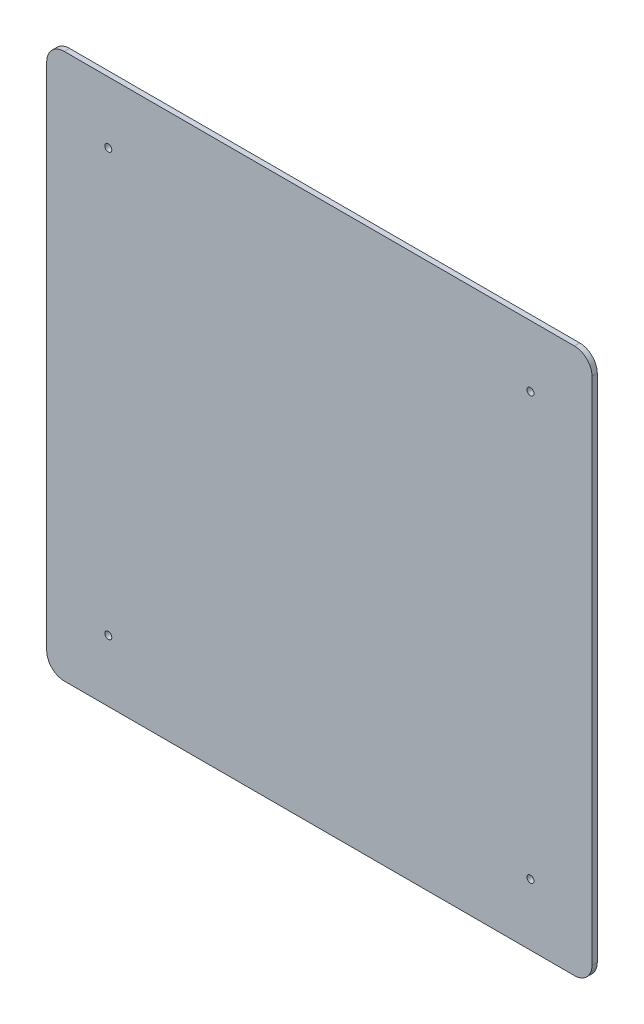
ISO-10303-21;
HEADER;
FILE_DESCRIPTION(('STEP AP214'),'2;1');
FILE_NAME('part.step','',(''),(''),'','','');
FILE_SCHEMA(('AUTOMOTIVE_DESIGN { 1 0 10303 214 1 1 1 1 }'));
ENDSEC;
DATA;
#1=APPLICATION_CONTEXT('core data for automotive mechanical design processes');
#2=APPLICATION_PROTOCOL_DEFINITION('international standard','automotive_design',2000,#1);
#3=PRODUCT_CONTEXT('',#1,'mechanical');
#4=PRODUCT('Part','Part','',(#3));
#5=PRODUCT_RELATED_PRODUCT_CATEGORY('part','',(#4));
#6=PRODUCT_DEFINITION_FORMATION('','',#4);
#7=PRODUCT_DEFINITION_CONTEXT('part definition',#1,'design');
#8=PRODUCT_DEFINITION('design','',#6,#7);
#9=PRODUCT_DEFINITION_SHAPE('','',#8);
#10=(LENGTH_UNIT() NAMED_UNIT(*) SI_UNIT(.MILLI.,.METRE.));
#11=(NAMED_UNIT(*) PLANE_ANGLE_UNIT() SI_UNIT($,.RADIAN.));
#12=(NAMED_UNIT(*) SI_UNIT($,.STERADIAN.) SOLID_ANGLE_UNIT());
#13=UNCERTAINTY_MEASURE_WITH_UNIT(LENGTH_MEASURE(1.E-05),#10,'distance_accuracy_value','');
#14=(GEOMETRIC_REPRESENTATION_CONTEXT(3) GLOBAL_UNCERTAINTY_ASSIGNED_CONTEXT((#13)) GLOBAL_UNIT_ASSIGNED_CONTEXT((#10,
#11,#12)) REPRESENTATION_CONTEXT('',''));
#15=CARTESIAN_POINT('',(0.,0.,0.));
#16=DIRECTION('',(0.,0.,1.));
#17=DIRECTION('',(1.,0.,0.));
#18=AXIS2_PLACEMENT_3D('',#15,#16,#17);
#19=CARTESIAN_POINT('',(132.416974169742,-135.562730627306,3.));
#20=DIRECTION('',(0.,0.,1.));
#21=DIRECTION('',(1.,0.,0.));
#22=AXIS2_PLACEMENT_3D('',#19,#20,#21);
#23=PLANE('',#22);
#24=CARTESIAN_POINT('',(-132.583025830258,129.437269372694,3.));
#25=DIRECTION('',(0.,0.,1.));
#26=DIRECTION('',(1.,0.,0.));
#27=AXIS2_PLACEMENT_3D('',#24,#25,#26);
#28=CIRCLE('',#27,2.);
#29=CARTESIAN_POINT('',(-130.583025830258,129.437269372694,3.));
#30=VERTEX_POINT('',#29);
#31=EDGE_CURVE('E188',#30,#30,#28,.T.);
#32=ORIENTED_EDGE('',*,*,#31,.F.);
#33=EDGE_LOOP('',(#32));
#34=FACE_BOUND('',#33,.T.);
#35=CARTESIAN_POINT('',(107.416974169742,129.437269372694,3.));
#36=DIRECTION('',(0.,0.,1.));
#37=DIRECTION('',(1.,0.,0.));
#38=AXIS2_PLACEMENT_3D('',#35,#36,#37);
#39=CIRCLE('',#38,2.);
#40=CARTESIAN_POINT('',(109.416974169742,129.437269372694,3.));
#41=VERTEX_POINT('',#40);
#42=EDGE_CURVE('E134',#41,#41,#39,.T.);
#43=ORIENTED_EDGE('',*,*,#42,.F.);
#44=EDGE_LOOP('',(#43));
#45=FACE_BOUND('',#44,.T.);
#46=CARTESIAN_POINT('',(132.416974169742,-135.562730627306,3.));
#47=DIRECTION('',(0.,0.,1.));
#48=DIRECTION('',(1.,0.,0.));
#49=AXIS2_PLACEMENT_3D('',#46,#47,#48);
#50=CIRCLE('',#49,10.);
#51=CARTESIAN_POINT('',(132.416974169742,-145.562730627306,3.));
#52=VERTEX_POINT('',#51);
#53=CARTESIAN_POINT('',(142.416974169742,-135.562730627306,3.));
#54=VERTEX_POINT('',#53);
#55=EDGE_CURVE('E145',#52,#54,#50,.T.);
#56=ORIENTED_EDGE('',*,*,#55,.T.);
#57=DIRECTION('',(0.,1.,0.));
#58=VECTOR('',#57,1.);
#59=CARTESIAN_POINT('',(142.416974169742,154.437269372694,3.));
#60=LINE('',#59,#58);
#61=CARTESIAN_POINT('',(142.416974169742,154.437269372694,3.));
#62=VERTEX_POINT('',#61);
#63=EDGE_CURVE('E93',#54,#62,#60,.T.);
#64=ORIENTED_EDGE('',*,*,#63,.T.);
#65=CARTESIAN_POINT('',(132.416974169742,154.437269372694,3.));
#66=DIRECTION('',(0.,0.,1.));
#67=DIRECTION('',(-1.,0.,0.));
#68=AXIS2_PLACEMENT_3D('',#65,#66,#67);
#69=CIRCLE('',#68,10.);
#70=CARTESIAN_POINT('',(132.416974169742,164.437269372694,3.));
#71=VERTEX_POINT('',#70);
#72=EDGE_CURVE('E160',#62,#71,#69,.T.);
#73=ORIENTED_EDGE('',*,*,#72,.T.);
#74=DIRECTION('',(-1.,0.,0.));
#75=VECTOR('',#74,1.);
#76=CARTESIAN_POINT('',(-157.583025830258,164.437269372694,3.));
#77=LINE('',#76,#75);
#78=CARTESIAN_POINT('',(-157.583025830258,164.437269372694,3.));
#79=VERTEX_POINT('',#78);
#80=EDGE_CURVE('E173',#71,#79,#77,.T.);
#81=ORIENTED_EDGE('',*,*,#80,.T.);
#82=CARTESIAN_POINT('',(-157.583025830258,154.437269372694,3.));
#83=DIRECTION('',(0.,0.,1.));
#84=DIRECTION('',(1.,0.,0.));
#85=AXIS2_PLACEMENT_3D('',#82,#83,#84);
#86=CIRCLE('',#85,10.);
#87=CARTESIAN_POINT('',(-167.583025830258,154.437269372694,3.));
#88=VERTEX_POINT('',#87);
#89=EDGE_CURVE('E112',#79,#88,#86,.T.);
#90=ORIENTED_EDGE('',*,*,#89,.T.);
#91=DIRECTION('',(0.,-1.,0.));
#92=VECTOR('',#91,1.);
#93=CARTESIAN_POINT('',(-167.583025830258,154.437269372694,3.));
#94=LINE('',#93,#92);
#95=CARTESIAN_POINT('',(-167.583025830258,-135.562730627306,3.));
#96=VERTEX_POINT('',#95);
#97=EDGE_CURVE('E106',#88,#96,#94,.T.);
#98=ORIENTED_EDGE('',*,*,#97,.T.);
#99=CARTESIAN_POINT('',(-157.583025830258,-135.562730627306,3.));
#100=DIRECTION('',(0.,0.,1.));
#101=DIRECTION('',(1.,0.,0.));
#102=AXIS2_PLACEMENT_3D('',#99,#100,#101);
#103=CIRCLE('',#102,10.);
#104=CARTESIAN_POINT('',(-157.583025830258,-145.562730627306,3.));
#105=VERTEX_POINT('',#104);
#106=EDGE_CURVE('E110',#96,#105,#103,.T.);
#107=ORIENTED_EDGE('',*,*,#106,.T.);
#108=DIRECTION('',(1.,0.,0.));
#109=VECTOR('',#108,1.);
#110=CARTESIAN_POINT('',(-157.583025830258,-145.562730627306,3.));
#111=LINE('',#110,#109);
#112=EDGE_CURVE('E50',#105,#52,#111,.T.);
#113=ORIENTED_EDGE('',*,*,#112,.T.);
#114=EDGE_LOOP('',(#56,#64,#73,#81,#90,#98,#107,#113));
#115=FACE_BOUND('',#114,.T.);
#116=CARTESIAN_POINT('',(107.416974169742,-110.562730627306,3.));
#117=DIRECTION('',(0.,0.,1.));
#118=DIRECTION('',(1.,0.,0.));
#119=AXIS2_PLACEMENT_3D('',#116,#117,#118);
#120=CIRCLE('',#119,2.);
#121=CARTESIAN_POINT('',(109.416974169742,-110.562730627306,3.));
#122=VERTEX_POINT('',#121);
#123=EDGE_CURVE('E182',#122,#122,#120,.T.);
#124=ORIENTED_EDGE('',*,*,#123,.F.);
#125=EDGE_LOOP('',(#124));
#126=FACE_BOUND('',#125,.T.);
#127=CARTESIAN_POINT('',(-132.583025830258,-110.562730627306,3.));
#128=DIRECTION('',(0.,0.,1.));
#129=DIRECTION('',(1.,0.,0.));
#130=AXIS2_PLACEMENT_3D('',#127,#128,#129);
#131=CIRCLE('',#130,2.);
#132=CARTESIAN_POINT('',(-130.583025830258,-110.562730627306,3.));
#133=VERTEX_POINT('',#132);
#134=EDGE_CURVE('E194',#133,#133,#131,.T.);
#135=ORIENTED_EDGE('',*,*,#134,.F.);
#136=EDGE_LOOP('',(#135));
#137=FACE_BOUND('',#136,.T.);
#138=ADVANCED_FACE('F33',(#34,#45,#115,#126,#137),#23,.T.);
#139=CARTESIAN_POINT('',(132.416974169742,-135.562730627306,0.));
#140=DIRECTION('',(0.,0.,1.));
#141=DIRECTION('',(1.,0.,0.));
#142=AXIS2_PLACEMENT_3D('',#139,#140,#141);
#143=PLANE('',#142);
#144=CARTESIAN_POINT('',(132.416974169742,-135.562730627306,0.));
#145=DIRECTION('',(0.,0.,1.));
#146=DIRECTION('',(1.,0.,0.));
#147=AXIS2_PLACEMENT_3D('',#144,#145,#146);
#148=CIRCLE('',#147,10.);
#149=CARTESIAN_POINT('',(132.416974169742,-145.562730627306,0.));
#150=VERTEX_POINT('',#149);
#151=CARTESIAN_POINT('',(142.416974169742,-135.562730627306,0.));
#152=VERTEX_POINT('',#151);
#153=EDGE_CURVE('E130',#150,#152,#148,.T.);
#154=ORIENTED_EDGE('',*,*,#153,.F.);
#155=DIRECTION('',(1.,0.,0.));
#156=VECTOR('',#155,1.);
#157=CARTESIAN_POINT('',(-157.583025830258,-145.562730627306,0.));
#158=LINE('',#157,#156);
#159=CARTESIAN_POINT('',(-157.583025830258,-145.562730627306,0.));
#160=VERTEX_POINT('',#159);
#161=EDGE_CURVE('E85',#160,#150,#158,.T.);
#162=ORIENTED_EDGE('',*,*,#161,.F.);
#163=CARTESIAN_POINT('',(-157.583025830258,-135.562730627306,0.));
#164=DIRECTION('',(0.,0.,1.));
#165=DIRECTION('',(1.,0.,0.));
#166=AXIS2_PLACEMENT_3D('',#163,#164,#165);
#167=CIRCLE('',#166,10.);
#168=CARTESIAN_POINT('',(-167.583025830258,-135.562730627306,0.));
#169=VERTEX_POINT('',#168);
#170=EDGE_CURVE('E79',#169,#160,#167,.T.);
#171=ORIENTED_EDGE('',*,*,#170,.F.);
#172=DIRECTION('',(0.,-1.,0.));
#173=VECTOR('',#172,1.);
#174=CARTESIAN_POINT('',(-167.583025830258,154.437269372694,0.));
#175=LINE('',#174,#173);
#176=CARTESIAN_POINT('',(-167.583025830258,154.437269372694,0.));
#177=VERTEX_POINT('',#176);
#178=EDGE_CURVE('E120',#177,#169,#175,.T.);
#179=ORIENTED_EDGE('',*,*,#178,.F.);
#180=CARTESIAN_POINT('',(-157.583025830258,154.437269372694,0.));
#181=DIRECTION('',(0.,0.,1.));
#182=DIRECTION('',(1.,0.,0.));
#183=AXIS2_PLACEMENT_3D('',#180,#181,#182);
#184=CIRCLE('',#183,10.);
#185=CARTESIAN_POINT('',(-157.583025830258,164.437269372694,0.));
#186=VERTEX_POINT('',#185);
#187=EDGE_CURVE('E140',#186,#177,#184,.T.);
#188=ORIENTED_EDGE('',*,*,#187,.F.);
#189=DIRECTION('',(-1.,0.,0.));
#190=VECTOR('',#189,1.);
#191=CARTESIAN_POINT('',(-157.583025830258,164.437269372694,0.));
#192=LINE('',#191,#190);
#193=CARTESIAN_POINT('',(132.416974169742,164.437269372694,0.));
#194=VERTEX_POINT('',#193);
#195=EDGE_CURVE('E138',#194,#186,#192,.T.);
#196=ORIENTED_EDGE('',*,*,#195,.F.);
#197=CARTESIAN_POINT('',(132.416974169742,154.437269372694,0.));
#198=DIRECTION('',(0.,0.,1.));
#199=DIRECTION('',(-1.,0.,0.));
#200=AXIS2_PLACEMENT_3D('',#197,#198,#199);
#201=CIRCLE('',#200,10.);
#202=CARTESIAN_POINT('',(142.416974169742,154.437269372694,0.));
#203=VERTEX_POINT('',#202);
#204=EDGE_CURVE('E136',#203,#194,#201,.T.);
#205=ORIENTED_EDGE('',*,*,#204,.F.);
#206=DIRECTION('',(0.,1.,0.));
#207=VECTOR('',#206,1.);
#208=CARTESIAN_POINT('',(142.416974169742,154.437269372694,0.));
#209=LINE('',#208,#207);
#210=EDGE_CURVE('E133',#152,#203,#209,.T.);
#211=ORIENTED_EDGE('',*,*,#210,.F.);
#212=EDGE_LOOP('',(#154,#162,#171,#179,#188,#196,#205,#211));
#213=FACE_BOUND('',#212,.T.);
#214=CARTESIAN_POINT('',(107.416974169742,129.437269372694,0.));
#215=DIRECTION('',(0.,0.,1.));
#216=DIRECTION('',(1.,0.,0.));
#217=AXIS2_PLACEMENT_3D('',#214,#215,#216);
#218=CIRCLE('',#217,2.);
#219=CARTESIAN_POINT('',(109.416974169742,129.437269372694,0.));
#220=VERTEX_POINT('',#219);
#221=EDGE_CURVE('E179',#220,#220,#218,.T.);
#222=ORIENTED_EDGE('',*,*,#221,.T.);
#223=EDGE_LOOP('',(#222));
#224=FACE_BOUND('',#223,.T.);
#225=CARTESIAN_POINT('',(107.416974169742,-110.562730627306,0.));
#226=DIRECTION('',(0.,0.,1.));
#227=DIRECTION('',(1.,0.,0.));
#228=AXIS2_PLACEMENT_3D('',#225,#226,#227);
#229=CIRCLE('',#228,2.);
#230=CARTESIAN_POINT('',(109.416974169742,-110.562730627306,0.));
#231=VERTEX_POINT('',#230);
#232=EDGE_CURVE('E185',#231,#231,#229,.T.);
#233=ORIENTED_EDGE('',*,*,#232,.T.);
#234=EDGE_LOOP('',(#233));
#235=FACE_BOUND('',#234,.T.);
#236=CARTESIAN_POINT('',(-132.583025830258,129.437269372694,0.));
#237=DIRECTION('',(0.,0.,1.));
#238=DIRECTION('',(1.,0.,0.));
#239=AXIS2_PLACEMENT_3D('',#236,#237,#238);
#240=CIRCLE('',#239,2.);
#241=CARTESIAN_POINT('',(-130.583025830258,129.437269372694,0.));
#242=VERTEX_POINT('',#241);
#243=EDGE_CURVE('E191',#242,#242,#240,.T.);
#244=ORIENTED_EDGE('',*,*,#243,.T.);
#245=EDGE_LOOP('',(#244));
#246=FACE_BOUND('',#245,.T.);
#247=CARTESIAN_POINT('',(-132.583025830258,-110.562730627306,0.));
#248=DIRECTION('',(0.,0.,1.));
#249=DIRECTION('',(1.,0.,0.));
#250=AXIS2_PLACEMENT_3D('',#247,#248,#249);
#251=CIRCLE('',#250,2.);
#252=CARTESIAN_POINT('',(-130.583025830258,-110.562730627306,0.));
#253=VERTEX_POINT('',#252);
#254=EDGE_CURVE('E197',#253,#253,#251,.T.);
#255=ORIENTED_EDGE('',*,*,#254,.T.);
#256=EDGE_LOOP('',(#255));
#257=FACE_BOUND('',#256,.T.);
#258=ADVANCED_FACE('F164',(#213,#224,#235,#246,#257),#143,.F.);
#259=CARTESIAN_POINT('',(132.416974169742,-135.562730627306,3.));
#260=DIRECTION('',(0.,0.,-1.));
#261=DIRECTION('',(-1.,0.,0.));
#262=AXIS2_PLACEMENT_3D('',#259,#260,#261);
#263=CYLINDRICAL_SURFACE('',#262,10.);
#264=ORIENTED_EDGE('',*,*,#153,.T.);
#265=DIRECTION('',(0.,0.,-1.));
#266=VECTOR('',#265,1.);
#267=CARTESIAN_POINT('',(142.416974169742,-135.562730627306,3.));
#268=LINE('',#267,#266);
#269=EDGE_CURVE('E11',#54,#152,#268,.T.);
#270=ORIENTED_EDGE('',*,*,#269,.F.);
#271=ORIENTED_EDGE('',*,*,#55,.F.);
#272=DIRECTION('',(0.,0.,-1.));
#273=VECTOR('',#272,1.);
#274=CARTESIAN_POINT('',(132.416974169742,-145.562730627306,3.));
#275=LINE('',#274,#273);
#276=EDGE_CURVE('E126',#52,#150,#275,.T.);
#277=ORIENTED_EDGE('',*,*,#276,.T.);
#278=EDGE_LOOP('',(#264,#270,#271,#277));
#279=FACE_BOUND('',#278,.T.);
#280=ADVANCED_FACE('F35',(#279),#263,.T.);
#281=CARTESIAN_POINT('',(142.416974169742,154.437269372694,3.));
#282=DIRECTION('',(-1.,0.,0.));
#283=DIRECTION('',(0.,-1.,0.));
#284=AXIS2_PLACEMENT_3D('',#281,#282,#283);
#285=PLANE('',#284);
#286=ORIENTED_EDGE('',*,*,#210,.T.);
#287=DIRECTION('',(0.,0.,-1.));
#288=VECTOR('',#287,1.);
#289=CARTESIAN_POINT('',(142.416974169742,154.437269372694,3.));
#290=LINE('',#289,#288);
#291=EDGE_CURVE('E42',#62,#203,#290,.T.);
#292=ORIENTED_EDGE('',*,*,#291,.F.);
#293=ORIENTED_EDGE('',*,*,#63,.F.);
#294=ORIENTED_EDGE('',*,*,#269,.T.);
#295=EDGE_LOOP('',(#286,#292,#293,#294));
#296=FACE_BOUND('',#295,.T.);
#297=ADVANCED_FACE('F231',(#296),#285,.F.);
#298=CARTESIAN_POINT('',(132.416974169742,154.437269372694,3.));
#299=DIRECTION('',(0.,0.,-1.));
#300=DIRECTION('',(-1.,0.,0.));
#301=AXIS2_PLACEMENT_3D('',#298,#299,#300);
#302=CYLINDRICAL_SURFACE('',#301,10.);
#303=ORIENTED_EDGE('',*,*,#204,.T.);
#304=DIRECTION('',(0.,0.,-1.));
#305=VECTOR('',#304,1.);
#306=CARTESIAN_POINT('',(132.416974169742,164.437269372694,3.));
#307=LINE('',#306,#305);
#308=EDGE_CURVE('E152',#71,#194,#307,.T.);
#309=ORIENTED_EDGE('',*,*,#308,.F.);
#310=ORIENTED_EDGE('',*,*,#72,.F.);
#311=ORIENTED_EDGE('',*,*,#291,.T.);
#312=EDGE_LOOP('',(#303,#309,#310,#311));
#313=FACE_BOUND('',#312,.T.);
#314=ADVANCED_FACE('F158',(#313),#302,.T.);
#315=CARTESIAN_POINT('',(-157.583025830258,164.437269372694,3.));
#316=DIRECTION('',(0.,-1.,0.));
#317=DIRECTION('',(0.,0.,-1.));
#318=AXIS2_PLACEMENT_3D('',#315,#316,#317);
#319=PLANE('',#318);
#320=ORIENTED_EDGE('',*,*,#195,.T.);
#321=DIRECTION('',(0.,0.,-1.));
#322=VECTOR('',#321,1.);
#323=CARTESIAN_POINT('',(-157.583025830258,164.437269372694,3.));
#324=LINE('',#323,#322);
#325=EDGE_CURVE('E149',#79,#186,#324,.T.);
#326=ORIENTED_EDGE('',*,*,#325,.F.);
#327=ORIENTED_EDGE('',*,*,#80,.F.);
#328=ORIENTED_EDGE('',*,*,#308,.T.);
#329=EDGE_LOOP('',(#320,#326,#327,#328));
#330=FACE_BOUND('',#329,.T.);
#331=ADVANCED_FACE('F169',(#330),#319,.F.);
#332=CARTESIAN_POINT('',(-157.583025830258,154.437269372694,3.));
#333=DIRECTION('',(0.,0.,-1.));
#334=DIRECTION('',(-1.,0.,0.));
#335=AXIS2_PLACEMENT_3D('',#332,#333,#334);
#336=CYLINDRICAL_SURFACE('',#335,10.);
#337=ORIENTED_EDGE('',*,*,#187,.T.);
#338=DIRECTION('',(0.,0.,-1.));
#339=VECTOR('',#338,1.);
#340=CARTESIAN_POINT('',(-167.583025830258,154.437269372694,3.));
#341=LINE('',#340,#339);
#342=EDGE_CURVE('E121',#88,#177,#341,.T.);
#343=ORIENTED_EDGE('',*,*,#342,.F.);
#344=ORIENTED_EDGE('',*,*,#89,.F.);
#345=ORIENTED_EDGE('',*,*,#325,.T.);
#346=EDGE_LOOP('',(#337,#343,#344,#345));
#347=FACE_BOUND('',#346,.T.);
#348=ADVANCED_FACE('F172',(#347),#336,.T.);
#349=CARTESIAN_POINT('',(-167.583025830258,154.437269372694,3.));
#350=DIRECTION('',(1.,0.,0.));
#351=DIRECTION('',(0.,0.,-1.));
#352=AXIS2_PLACEMENT_3D('',#349,#350,#351);
#353=PLANE('',#352);
#354=ORIENTED_EDGE('',*,*,#178,.T.);
#355=DIRECTION('',(0.,0.,-1.));
#356=VECTOR('',#355,1.);
#357=CARTESIAN_POINT('',(-167.583025830258,-135.562730627306,3.));
#358=LINE('',#357,#356);
#359=EDGE_CURVE('E117',#96,#169,#358,.T.);
#360=ORIENTED_EDGE('',*,*,#359,.F.);
#361=ORIENTED_EDGE('',*,*,#97,.F.);
#362=ORIENTED_EDGE('',*,*,#342,.T.);
#363=EDGE_LOOP('',(#354,#360,#361,#362));
#364=FACE_BOUND('',#363,.T.);
#365=ADVANCED_FACE('F118',(#364),#353,.F.);
#366=CARTESIAN_POINT('',(-157.583025830258,-135.562730627306,3.));
#367=DIRECTION('',(0.,0.,-1.));
#368=DIRECTION('',(-1.,0.,0.));
#369=AXIS2_PLACEMENT_3D('',#366,#367,#368);
#370=CYLINDRICAL_SURFACE('',#369,10.);
#371=ORIENTED_EDGE('',*,*,#170,.T.);
#372=DIRECTION('',(0.,0.,-1.));
#373=VECTOR('',#372,1.);
#374=CARTESIAN_POINT('',(-157.583025830258,-145.562730627306,3.));
#375=LINE('',#374,#373);
#376=EDGE_CURVE('E122',#105,#160,#375,.T.);
#377=ORIENTED_EDGE('',*,*,#376,.F.);
#378=ORIENTED_EDGE('',*,*,#106,.F.);
#379=ORIENTED_EDGE('',*,*,#359,.T.);
#380=EDGE_LOOP('',(#371,#377,#378,#379));
#381=FACE_BOUND('',#380,.T.);
#382=ADVANCED_FACE('F124',(#381),#370,.T.);
#383=CARTESIAN_POINT('',(-157.583025830258,-145.562730627306,3.));
#384=DIRECTION('',(0.,1.,0.));
#385=DIRECTION('',(0.,0.,1.));
#386=AXIS2_PLACEMENT_3D('',#383,#384,#385);
#387=PLANE('',#386);
#388=ORIENTED_EDGE('',*,*,#161,.T.);
#389=ORIENTED_EDGE('',*,*,#276,.F.);
#390=ORIENTED_EDGE('',*,*,#112,.F.);
#391=ORIENTED_EDGE('',*,*,#376,.T.);
#392=EDGE_LOOP('',(#388,#389,#390,#391));
#393=FACE_BOUND('',#392,.T.);
#394=ADVANCED_FACE('F219',(#393),#387,.F.);
#395=CARTESIAN_POINT('',(107.416974169742,129.437269372694,3.));
#396=DIRECTION('',(0.,0.,-1.));
#397=DIRECTION('',(-1.,0.,0.));
#398=AXIS2_PLACEMENT_3D('',#395,#396,#397);
#399=CYLINDRICAL_SURFACE('',#398,2.);
#400=ORIENTED_EDGE('',*,*,#42,.T.);
#401=EDGE_LOOP('',(#400));
#402=FACE_BOUND('',#401,.T.);
#403=ORIENTED_EDGE('',*,*,#221,.F.);
#404=EDGE_LOOP('',(#403));
#405=FACE_BOUND('',#404,.T.);
#406=ADVANCED_FACE('F216',(#402,#405),#399,.F.);
#407=CARTESIAN_POINT('',(107.416974169742,-110.562730627306,3.));
#408=DIRECTION('',(0.,0.,-1.));
#409=DIRECTION('',(-1.,0.,0.));
#410=AXIS2_PLACEMENT_3D('',#407,#408,#409);
#411=CYLINDRICAL_SURFACE('',#410,2.);
#412=ORIENTED_EDGE('',*,*,#123,.T.);
#413=EDGE_LOOP('',(#412));
#414=FACE_BOUND('',#413,.T.);
#415=ORIENTED_EDGE('',*,*,#232,.F.);
#416=EDGE_LOOP('',(#415));
#417=FACE_BOUND('',#416,.T.);
#418=ADVANCED_FACE('F295',(#414,#417),#411,.F.);
#419=CARTESIAN_POINT('',(-132.583025830258,129.437269372694,3.));
#420=DIRECTION('',(0.,0.,-1.));
#421=DIRECTION('',(-1.,0.,0.));
#422=AXIS2_PLACEMENT_3D('',#419,#420,#421);
#423=CYLINDRICAL_SURFACE('',#422,2.);
#424=ORIENTED_EDGE('',*,*,#31,.T.);
#425=EDGE_LOOP('',(#424));
#426=FACE_BOUND('',#425,.T.);
#427=ORIENTED_EDGE('',*,*,#243,.F.);
#428=EDGE_LOOP('',(#427));
#429=FACE_BOUND('',#428,.T.);
#430=ADVANCED_FACE('F303',(#426,#429),#423,.F.);
#431=CARTESIAN_POINT('',(-132.583025830258,-110.562730627306,3.));
#432=DIRECTION('',(0.,0.,-1.));
#433=DIRECTION('',(-1.,0.,0.));
#434=AXIS2_PLACEMENT_3D('',#431,#432,#433);
#435=CYLINDRICAL_SURFACE('',#434,2.);
#436=ORIENTED_EDGE('',*,*,#134,.T.);
#437=EDGE_LOOP('',(#436));
#438=FACE_BOUND('',#437,.T.);
#439=ORIENTED_EDGE('',*,*,#254,.F.);
#440=EDGE_LOOP('',(#439));
#441=FACE_BOUND('',#440,.T.);
#442=ADVANCED_FACE('F203',(#438,#441),#435,.F.);
#443=CLOSED_SHELL('',(#138,#258,#280,#297,#314,#331,#348,#365,#382,#394,#406,#418,#430,#442));
#444=MANIFOLD_SOLID_BREP('B2',#443);
#445=ADVANCED_BREP_SHAPE_REPRESENTATION('',(#18,#444),#14);
#446=SHAPE_DEFINITION_REPRESENTATION(#9,#445);
ENDSEC;
END-ISO-10303-21;
